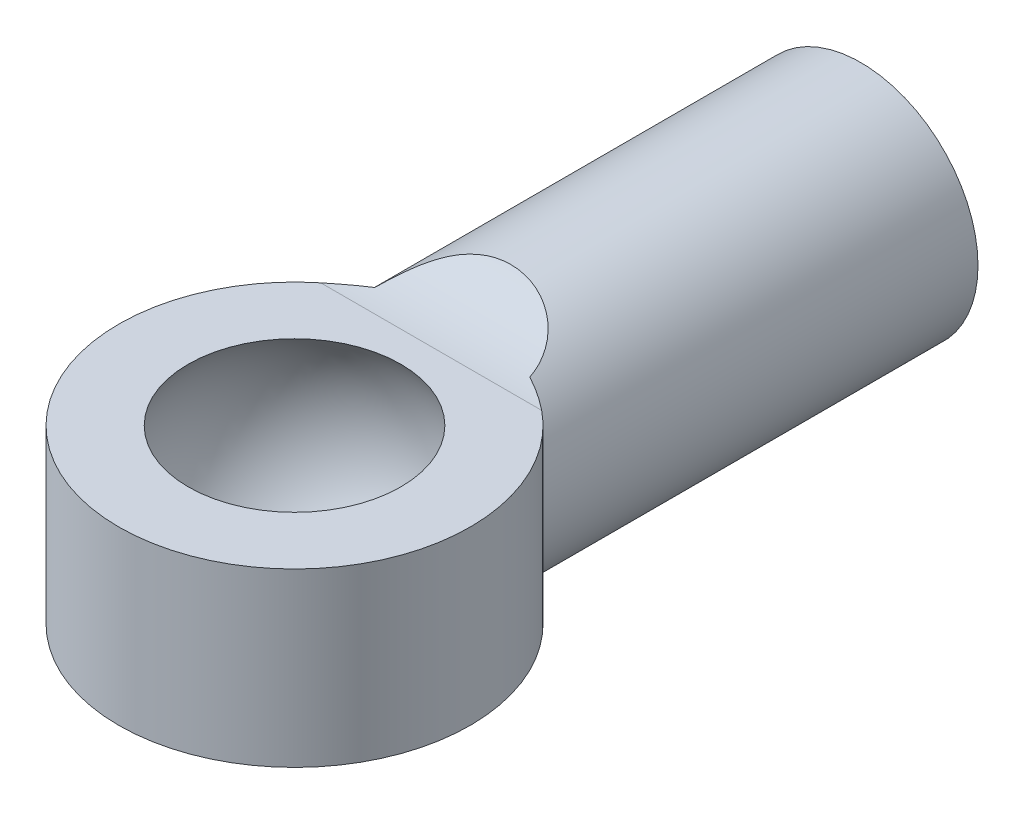
ISO-10303-21;
HEADER;
FILE_DESCRIPTION(('STEP AP214'),'2;1');
FILE_NAME('part.step','',(''),(''),'','','');
FILE_SCHEMA(('AUTOMOTIVE_DESIGN { 1 0 10303 214 1 1 1 1 }'));
ENDSEC;
DATA;
#1=APPLICATION_CONTEXT('core data for automotive mechanical design processes');
#2=APPLICATION_PROTOCOL_DEFINITION('international standard','automotive_design',2000,#1);
#3=PRODUCT_CONTEXT('',#1,'mechanical');
#4=PRODUCT('Part','Part','',(#3));
#5=PRODUCT_RELATED_PRODUCT_CATEGORY('part','',(#4));
#6=PRODUCT_DEFINITION_FORMATION('','',#4);
#7=PRODUCT_DEFINITION_CONTEXT('part definition',#1,'design');
#8=PRODUCT_DEFINITION('design','',#6,#7);
#9=PRODUCT_DEFINITION_SHAPE('','',#8);
#10=(LENGTH_UNIT() NAMED_UNIT(*) SI_UNIT(.MILLI.,.METRE.));
#11=(NAMED_UNIT(*) PLANE_ANGLE_UNIT() SI_UNIT($,.RADIAN.));
#12=(NAMED_UNIT(*) SI_UNIT($,.STERADIAN.) SOLID_ANGLE_UNIT());
#13=UNCERTAINTY_MEASURE_WITH_UNIT(LENGTH_MEASURE(1.E-05),#10,'distance_accuracy_value','');
#14=(GEOMETRIC_REPRESENTATION_CONTEXT(3) GLOBAL_UNCERTAINTY_ASSIGNED_CONTEXT((#13)) GLOBAL_UNIT_ASSIGNED_CONTEXT((#10,
#11,#12)) REPRESENTATION_CONTEXT('',''));
#15=CARTESIAN_POINT('',(0.,0.,0.));
#16=DIRECTION('',(0.,0.,1.));
#17=DIRECTION('',(1.,0.,0.));
#18=AXIS2_PLACEMENT_3D('',#15,#16,#17);
#19=CARTESIAN_POINT('',(0.,0.,12.));
#20=DIRECTION('',(0.,0.,-1.));
#21=DIRECTION('',(-1.,0.,0.));
#22=AXIS2_PLACEMENT_3D('',#19,#20,#21);
#23=CYLINDRICAL_SURFACE('',#22,3.);
#24=CARTESIAN_POINT('',(1.98583426974193,-2.2486578781839,10.4618739181251));
#25=CARTESIAN_POINT('',(2.00396344258288,-2.23264706002368,10.4707882630477));
#26=CARTESIAN_POINT('',(2.02188887402468,-2.21642667728664,10.4797553414252));
#27=CARTESIAN_POINT('',(2.16533009791416,-2.08344672270652,10.5526981013084));
#28=CARTESIAN_POINT('',(2.2806563095797,-1.95650770931752,10.6188131588102));
#29=CARTESIAN_POINT('',(2.48880177067207,-1.68385902351801,10.7488693801545));
#30=CARTESIAN_POINT('',(2.58156488423051,-1.53810388776794,10.8128047884442));
#31=CARTESIAN_POINT('',(2.72762982526368,-1.2571458702699,10.9199560604471));
#32=CARTESIAN_POINT('',(2.78502144127264,-1.12471394387148,10.9648327031429));
#33=CARTESIAN_POINT('',(2.88078101458543,-0.849794356010161,11.0424080187158));
#34=CARTESIAN_POINT('',(2.91918948889255,-0.707328859455994,11.075132591104));
#35=CARTESIAN_POINT('',(2.96104647539865,-0.487722819349375,11.111411163226));
#36=CARTESIAN_POINT('',(2.97239258027734,-0.413067791939371,11.1213898986211));
#37=CARTESIAN_POINT('',(2.98943725584207,-0.262642958108292,11.1364602207128));
#38=CARTESIAN_POINT('',(2.9951388625948,-0.186873773254045,11.1415544346527));
#39=CARTESIAN_POINT('',(3.00075826896958,-0.0349766015231395,11.1465741730226));
#40=CARTESIAN_POINT('',(3.00067827639566,0.041151237290717,11.1465016704532));
#41=CARTESIAN_POINT('',(2.99475194614686,0.192977883665955,11.1412098629645));
#42=CARTESIAN_POINT('',(2.98890607906159,0.268676725733381,11.1359909780743));
#43=CARTESIAN_POINT('',(2.9656435566549,0.47021885483297,11.1154221135443));
#44=CARTESIAN_POINT('',(2.94305491250344,0.595054783923677,11.0955903532735));
#45=CARTESIAN_POINT('',(2.88311206709104,0.838743854227943,11.0446882070705));
#46=CARTESIAN_POINT('',(2.84573597042278,0.957587827770217,11.0136011615418));
#47=CARTESIAN_POINT('',(2.74039122046619,1.23273200092434,10.9297954285942));
#48=CARTESIAN_POINT('',(2.66617507507191,1.38551275785537,10.8733711871864));
#49=CARTESIAN_POINT('',(2.49497805419315,1.67430722603556,10.7535359487626));
#50=CARTESIAN_POINT('',(2.39800712087454,1.81032822059377,10.6901280095102));
#51=CARTESIAN_POINT('',(2.21235575127324,2.02980585610405,10.5803378735073));
#52=CARTESIAN_POINT('',(2.12860529813086,2.11749146089412,10.5340200533864));
#53=CARTESIAN_POINT('',(2.02189044273492,2.21642556064357,10.4797566856895));
#54=CARTESIAN_POINT('',(2.00396513097984,2.23264594541698,10.4707897454018));
#55=CARTESIAN_POINT('',(1.98583426974193,2.2486578781839,10.4618739181251));
#56=B_SPLINE_CURVE_WITH_KNOTS('',3,(#24,#25,#26,#27,#28,#29,#30,#31,#32,#33,#34,#35,#36,#37,#38,
#39,#40,#41,#42,#43,#44,#45,#46,#47,#48,#49,#50,#51,#52,#53,#54,#55),.UNSPECIFIED.,.F.,.F.,(4,2,
2,2,2,2,2,2,2,2,2,2,2,2,2,4),(0.,0.0773456803517175,0.626141542848898,1.17628912782317,
1.62809695261956,2.07893624356484,2.30712469679806,2.53519034506865,2.76316890297447,
2.99112885564308,3.37454256246388,3.75852611777623,4.29261845738536,4.82647787108041,
5.21499910517706,5.29234478552878),.UNSPECIFIED.);
#57=CARTESIAN_POINT('',(1.98583426974193,-2.2486578781839,10.4618739181251));
#58=VERTEX_POINT('',#57);
#59=CARTESIAN_POINT('',(1.98583426974193,2.2486578781839,10.4618739181251));
#60=VERTEX_POINT('',#59);
#61=EDGE_CURVE('E57',#58,#60,#56,.T.);
#62=ORIENTED_EDGE('',*,*,#61,.F.);
#63=CARTESIAN_POINT('',(1.98583426974193,-2.2486578781839,10.4618739181251));
#64=CARTESIAN_POINT('',(1.97502394561147,-2.25819351123642,10.4095181028285));
#65=CARTESIAN_POINT('',(1.96254938670621,-2.26908227167806,10.3577497916272));
#66=CARTESIAN_POINT('',(1.93418135977784,-2.29331726265383,10.2557363077332));
#67=CARTESIAN_POINT('',(1.91828717330944,-2.30666400951265,10.2054914576463));
#68=CARTESIAN_POINT('',(1.88299058933512,-2.33556469764909,10.1068860311701));
#69=CARTESIAN_POINT('',(1.86358752929888,-2.35111905563874,10.0585258127286));
#70=CARTESIAN_POINT('',(1.82122190942769,-2.38408731811387,9.96407357766055));
#71=CARTESIAN_POINT('',(1.79825970184295,-2.40150103852452,9.91798133716555));
#72=CARTESIAN_POINT('',(1.72382449295788,-2.456057147341,9.78340028531918));
#73=CARTESIAN_POINT('',(1.66685512443128,-2.49546922832326,9.69875627003776));
#74=CARTESIAN_POINT('',(1.53876853028249,-2.57641178970525,9.54241281251451));
#75=CARTESIAN_POINT('',(1.46766981161845,-2.61793944671062,9.47069666894049));
#76=CARTESIAN_POINT('',(1.31530194403671,-2.69761113004928,9.34365113595016));
#77=CARTESIAN_POINT('',(1.23446628803176,-2.73582239339714,9.2878432925376));
#78=CARTESIAN_POINT('',(1.0627931505943,-2.80697465032155,9.18971728272768));
#79=CARTESIAN_POINT('',(0.971945409852168,-2.83991015149231,9.147413129647));
#80=CARTESIAN_POINT('',(0.781583895473862,-2.89813280242022,9.07553019732255));
#81=CARTESIAN_POINT('',(0.681970526141148,-2.92331184661366,9.04612905294371));
#82=CARTESIAN_POINT('',(0.477981132613831,-2.96349647505828,9.00025224488269));
#83=CARTESIAN_POINT('',(0.373613107648135,-2.97851851848967,8.9837556628189));
#84=CARTESIAN_POINT('',(0.223790947362484,-2.99197652387999,8.96907491700125));
#85=CARTESIAN_POINT('',(0.179153847261406,-2.99498059666431,8.96581743893957));
#86=CARTESIAN_POINT('',(0.089684486346388,-2.99899353994938,8.96147632373524));
#87=CARTESIAN_POINT('',(0.0448522223363826,-3.00000237765141,8.96039272232791));
#88=CARTESIAN_POINT('',(-0.110619865372835,-2.99999413595437,8.96039089292625));
#89=CARTESIAN_POINT('',(-0.221361131794522,-2.99383732507076,8.96697763247477));
#90=CARTESIAN_POINT('',(-0.440038767243054,-2.96959711123984,8.99360583003985));
#91=CARTESIAN_POINT('',(-0.547969664140814,-2.95149202081765,9.01367175548592));
#92=CARTESIAN_POINT('',(-0.757970567756772,-2.90466030744831,9.06798059154988));
#93=CARTESIAN_POINT('',(-0.86003412804245,-2.87592225037414,9.10223876852384));
#94=CARTESIAN_POINT('',(-1.05497771436313,-2.81026536974166,9.18562264602873));
#95=CARTESIAN_POINT('',(-1.14786541653369,-2.77335346933673,9.2347357773847));
#96=CARTESIAN_POINT('',(-1.31993308427235,-2.69564770776983,9.34689422870082));
#97=CARTESIAN_POINT('',(-1.39935423836713,-2.65494851227216,9.40963456064827));
#98=CARTESIAN_POINT('',(-1.54477201211523,-2.57306455453708,9.54889356617166));
#99=CARTESIAN_POINT('',(-1.61076662307727,-2.5318797206189,9.62541429815452));
#100=CARTESIAN_POINT('',(-1.72624575060594,-2.45453715014255,9.78747767252285));
#101=CARTESIAN_POINT('',(-1.77623237368698,-2.41825300295412,9.87260461829727));
#102=CARTESIAN_POINT('',(-1.86279132398585,-2.35222983444232,10.0516939199302));
#103=CARTESIAN_POINT('',(-1.89937509934928,-2.32248523603928,10.1456486488633));
#104=CARTESIAN_POINT('',(-1.94063185959484,-2.28782727153899,10.2784498112609));
#105=CARTESIAN_POINT('',(-1.95087955775204,-2.27908386932466,10.3146837900079));
#106=CARTESIAN_POINT('',(-1.96963835611927,-2.26289139367312,10.3878008133385));
#107=CARTESIAN_POINT('',(-1.97815296337021,-2.2554397109724,10.4246823797312));
#108=CARTESIAN_POINT('',(-1.98583426974193,-2.2486578781839,10.4618739181251));
#109=B_SPLINE_CURVE_WITH_KNOTS('',3,(#63,#64,#65,#66,#67,#68,#69,#70,#71,#72,#73,#74,#75,#76,
#77,#78,#79,#80,#81,#82,#83,#84,#85,#86,#87,#88,#89,#90,#91,#92,#93,#94,#95,#96,#97,#98,#99,
#100,#101,#102,#103,#104,#105,#106,#107,#108),.UNSPECIFIED.,.F.,.F.,(4,2,2,2,2,2,2,2,2,2,2,2,2,
2,2,2,2,2,2,2,2,2,4),(0.,0.162869949889913,0.325774151349316,0.488709143851404,
0.651628020898908,0.977952409452353,1.30385215479923,1.61855188320804,1.93357713427024,
2.25281278282816,2.57152986970544,2.70602034349497,2.84051302809058,3.1722148231994,
3.50452035656807,3.83718427716365,4.16956750559809,4.4951631826996,4.82080753510333,
5.13491442068979,5.44875238046031,5.56467397189046,5.68035860255983),.UNSPECIFIED.);
#110=CARTESIAN_POINT('',(-1.98583426974193,-2.2486578781839,10.4618739181251));
#111=VERTEX_POINT('',#110);
#112=EDGE_CURVE('E89',#58,#111,#109,.T.);
#113=ORIENTED_EDGE('',*,*,#112,.T.);
#114=CARTESIAN_POINT('',(-1.98583426974193,2.2486578781839,10.4618739181251));
#115=CARTESIAN_POINT('',(-2.00396344258288,2.23264706002368,10.4707882630477));
#116=CARTESIAN_POINT('',(-2.02188887402468,2.21642667728664,10.4797553414252));
#117=CARTESIAN_POINT('',(-2.16533009791416,2.08344672270652,10.5526981013084));
#118=CARTESIAN_POINT('',(-2.2806563095797,1.95650770931752,10.6188131588102));
#119=CARTESIAN_POINT('',(-2.48880177067207,1.68385902351801,10.7488693801545));
#120=CARTESIAN_POINT('',(-2.58156488423051,1.53810388776794,10.8128047884442));
#121=CARTESIAN_POINT('',(-2.72762982526368,1.2571458702699,10.9199560604471));
#122=CARTESIAN_POINT('',(-2.78502144127264,1.12471394387148,10.9648327031429));
#123=CARTESIAN_POINT('',(-2.88078101458543,0.849794356010161,11.0424080187158));
#124=CARTESIAN_POINT('',(-2.91918948889255,0.707328859455994,11.075132591104));
#125=CARTESIAN_POINT('',(-2.96104647539865,0.487722819349375,11.111411163226));
#126=CARTESIAN_POINT('',(-2.97239258027734,0.413067791939371,11.1213898986211));
#127=CARTESIAN_POINT('',(-2.98943725584207,0.262642958108292,11.1364602207128));
#128=CARTESIAN_POINT('',(-2.9951388625948,0.186873773254045,11.1415544346527));
#129=CARTESIAN_POINT('',(-3.00075826896958,0.0349766015231395,11.1465741730226));
#130=CARTESIAN_POINT('',(-3.00067827639566,-0.041151237290717,11.1465016704532));
#131=CARTESIAN_POINT('',(-2.99475194614686,-0.192977883665955,11.1412098629645));
#132=CARTESIAN_POINT('',(-2.98890607906159,-0.268676725733381,11.1359909780743));
#133=CARTESIAN_POINT('',(-2.9656435566549,-0.47021885483297,11.1154221135443));
#134=CARTESIAN_POINT('',(-2.94305491250344,-0.595054783923677,11.0955903532735));
#135=CARTESIAN_POINT('',(-2.88311206709104,-0.838743854227943,11.0446882070705));
#136=CARTESIAN_POINT('',(-2.84573597042278,-0.957587827770217,11.0136011615418));
#137=CARTESIAN_POINT('',(-2.74039122046619,-1.23273200092434,10.9297954285942));
#138=CARTESIAN_POINT('',(-2.66617507507191,-1.38551275785537,10.8733711871864));
#139=CARTESIAN_POINT('',(-2.49497805419315,-1.67430722603556,10.7535359487626));
#140=CARTESIAN_POINT('',(-2.39800712087454,-1.81032822059377,10.6901280095102));
#141=CARTESIAN_POINT('',(-2.21235575127324,-2.02980585610405,10.5803378735073));
#142=CARTESIAN_POINT('',(-2.12860529813086,-2.11749146089412,10.5340200533864));
#143=CARTESIAN_POINT('',(-2.02189044273492,-2.21642556064357,10.4797566856895));
#144=CARTESIAN_POINT('',(-2.00396513097984,-2.23264594541698,10.4707897454018));
#145=CARTESIAN_POINT('',(-1.98583426974193,-2.2486578781839,10.4618739181251));
#146=B_SPLINE_CURVE_WITH_KNOTS('',3,(#114,#115,#116,#117,#118,#119,#120,#121,#122,#123,#124,
#125,#126,#127,#128,#129,#130,#131,#132,#133,#134,#135,#136,#137,#138,#139,#140,#141,#142,#143,
#144,#145),.UNSPECIFIED.,.F.,.F.,(4,2,2,2,2,2,2,2,2,2,2,2,2,2,2,4),(0.,0.0773456803517175,
0.626141542848898,1.17628912782317,1.62809695261956,2.07893624356484,2.30712469679806,
2.53519034506865,2.76316890297447,2.99112885564308,3.37454256246388,3.75852611777623,
4.29261845738536,4.82647787108041,5.21499910517706,5.29234478552878),.UNSPECIFIED.);
#147=CARTESIAN_POINT('',(-1.98583426974193,2.2486578781839,10.4618739181251));
#148=VERTEX_POINT('',#147);
#149=EDGE_CURVE('E65',#148,#111,#146,.T.);
#150=ORIENTED_EDGE('',*,*,#149,.F.);
#151=CARTESIAN_POINT('',(-1.98583426974193,2.2486578781839,10.4618739181251));
#152=CARTESIAN_POINT('',(-1.97502394561147,2.25819351123642,10.4095181028285));
#153=CARTESIAN_POINT('',(-1.96254938670621,2.26908227167806,10.3577497916272));
#154=CARTESIAN_POINT('',(-1.93418135977784,2.29331726265383,10.2557363077332));
#155=CARTESIAN_POINT('',(-1.91828717330944,2.30666400951265,10.2054914576463));
#156=CARTESIAN_POINT('',(-1.88299058933512,2.33556469764909,10.1068860311701));
#157=CARTESIAN_POINT('',(-1.86358752929888,2.35111905563874,10.0585258127286));
#158=CARTESIAN_POINT('',(-1.82122190942769,2.38408731811387,9.96407357766055));
#159=CARTESIAN_POINT('',(-1.79825970184295,2.40150103852452,9.91798133716555));
#160=CARTESIAN_POINT('',(-1.72382449295788,2.456057147341,9.78340028531918));
#161=CARTESIAN_POINT('',(-1.66685512443128,2.49546922832326,9.69875627003776));
#162=CARTESIAN_POINT('',(-1.53876853028249,2.57641178970525,9.54241281251451));
#163=CARTESIAN_POINT('',(-1.46766981161845,2.61793944671062,9.47069666894049));
#164=CARTESIAN_POINT('',(-1.31530194403671,2.69761113004928,9.34365113595016));
#165=CARTESIAN_POINT('',(-1.23446628803176,2.73582239339714,9.2878432925376));
#166=CARTESIAN_POINT('',(-1.0627931505943,2.80697465032155,9.18971728272768));
#167=CARTESIAN_POINT('',(-0.971945409852168,2.83991015149231,9.147413129647));
#168=CARTESIAN_POINT('',(-0.781583895473862,2.89813280242022,9.07553019732255));
#169=CARTESIAN_POINT('',(-0.681970526141148,2.92331184661366,9.04612905294371));
#170=CARTESIAN_POINT('',(-0.477981132613831,2.96349647505828,9.00025224488269));
#171=CARTESIAN_POINT('',(-0.373613107648135,2.97851851848967,8.9837556628189));
#172=CARTESIAN_POINT('',(-0.223790947362484,2.99197652387999,8.96907491700125));
#173=CARTESIAN_POINT('',(-0.179153847261406,2.99498059666431,8.96581743893957));
#174=CARTESIAN_POINT('',(-0.0896844863463881,2.99899353994938,8.96147632373524));
#175=CARTESIAN_POINT('',(-0.0448522223363829,3.00000237765141,8.96039272232791));
#176=CARTESIAN_POINT('',(0.110619865372834,2.99999413595437,8.96039089292625));
#177=CARTESIAN_POINT('',(0.221361131794521,2.99383732507076,8.96697763247477));
#178=CARTESIAN_POINT('',(0.440038767243053,2.96959711123984,8.99360583003985));
#179=CARTESIAN_POINT('',(0.547969664140813,2.95149202081765,9.01367175548592));
#180=CARTESIAN_POINT('',(0.757970567756771,2.90466030744831,9.06798059154988));
#181=CARTESIAN_POINT('',(0.860034128042449,2.87592225037414,9.10223876852384));
#182=CARTESIAN_POINT('',(1.05497771436313,2.81026536974166,9.18562264602873));
#183=CARTESIAN_POINT('',(1.14786541653369,2.77335346933673,9.2347357773847));
#184=CARTESIAN_POINT('',(1.31993308427235,2.69564770776983,9.34689422870083));
#185=CARTESIAN_POINT('',(1.39935423836713,2.65494851227216,9.40963456064827));
#186=CARTESIAN_POINT('',(1.54477201211523,2.57306455453708,9.54889356617166));
#187=CARTESIAN_POINT('',(1.61076662307727,2.5318797206189,9.62541429815452));
#188=CARTESIAN_POINT('',(1.72624575060594,2.45453715014255,9.78747767252284));
#189=CARTESIAN_POINT('',(1.77623237368698,2.41825300295412,9.87260461829727));
#190=CARTESIAN_POINT('',(1.86279132398585,2.35222983444232,10.0516939199302));
#191=CARTESIAN_POINT('',(1.89937509934928,2.32248523603928,10.1456486488633));
#192=CARTESIAN_POINT('',(1.94063185959484,2.28782727153899,10.2784498112609));
#193=CARTESIAN_POINT('',(1.95087955775204,2.27908386932466,10.3146837900079));
#194=CARTESIAN_POINT('',(1.96963835611927,2.26289139367312,10.3878008133385));
#195=CARTESIAN_POINT('',(1.97815296337022,2.2554397109724,10.4246823797312));
#196=CARTESIAN_POINT('',(1.98583426974193,2.2486578781839,10.4618739181251));
#197=B_SPLINE_CURVE_WITH_KNOTS('',3,(#151,#152,#153,#154,#155,#156,#157,#158,#159,#160,#161,
#162,#163,#164,#165,#166,#167,#168,#169,#170,#171,#172,#173,#174,#175,#176,#177,#178,#179,#180,
#181,#182,#183,#184,#185,#186,#187,#188,#189,#190,#191,#192,#193,#194,#195,#196),.UNSPECIFIED.,
.F.,.F.,(4,2,2,2,2,2,2,2,2,2,2,2,2,2,2,2,2,2,2,2,2,2,4),(0.,0.162869949889913,0.325774151349316,
0.488709143851404,0.651628020898908,0.977952409452353,1.30385215479923,1.61855188320804,
1.93357713427024,2.25281278282816,2.57152986970544,2.70602034349497,2.84051302809058,
3.1722148231994,3.50452035656807,3.83718427716365,4.16956750559809,4.4951631826996,
4.82080753510333,5.13491442068979,5.44875238046031,5.56467397189046,5.68035860255983),.UNSPECIFIED.);
#198=EDGE_CURVE('E87',#148,#60,#197,.T.);
#199=ORIENTED_EDGE('',*,*,#198,.T.);
#200=EDGE_LOOP('',(#62,#113,#150,#199));
#201=FACE_BOUND('',#200,.T.);
#202=CARTESIAN_POINT('',(0.,0.,0.));
#203=DIRECTION('',(0.,0.,1.));
#204=DIRECTION('',(1.,0.,0.));
#205=AXIS2_PLACEMENT_3D('',#202,#203,#204);
#206=CIRCLE('',#205,3.);
#207=CARTESIAN_POINT('',(3.,0.,0.));
#208=VERTEX_POINT('',#207);
#209=EDGE_CURVE('E99',#208,#208,#206,.T.);
#210=ORIENTED_EDGE('',*,*,#209,.T.);
#211=EDGE_LOOP('',(#210));
#212=FACE_BOUND('',#211,.T.);
#213=ADVANCED_FACE('F39',(#201,#212),#23,.T.);
#214=CARTESIAN_POINT('',(0.,0.,0.));
#215=DIRECTION('',(0.,0.,1.));
#216=DIRECTION('',(1.,0.,0.));
#217=AXIS2_PLACEMENT_3D('',#214,#215,#216);
#218=PLANE('',#217);
#219=CARTESIAN_POINT('',(0.,0.,0.));
#220=DIRECTION('',(0.,0.,1.));
#221=DIRECTION('',(1.,0.,0.));
#222=AXIS2_PLACEMENT_3D('',#219,#220,#221);
#223=CIRCLE('',#222,1.6);
#224=CARTESIAN_POINT('',(1.6,0.,0.));
#225=VERTEX_POINT('',#224);
#226=EDGE_CURVE('E44',#225,#225,#223,.F.);
#227=ORIENTED_EDGE('',*,*,#226,.F.);
#228=EDGE_LOOP('',(#227));
#229=FACE_BOUND('',#228,.T.);
#230=ORIENTED_EDGE('',*,*,#209,.F.);
#231=EDGE_LOOP('',(#230));
#232=FACE_BOUND('',#231,.T.);
#233=ADVANCED_FACE('F126',(#229,#232),#218,.F.);
#234=CARTESIAN_POINT('',(0.,2.2,14.5));
#235=DIRECTION('',(0.,-1.,0.));
#236=DIRECTION('',(0.,0.,-1.));
#237=AXIS2_PLACEMENT_3D('',#234,#235,#236);
#238=CYLINDRICAL_SURFACE('',#237,4.5);
#239=CARTESIAN_POINT('',(0.,2.2,14.5));
#240=DIRECTION('',(0.,1.,0.));
#241=DIRECTION('',(0.,0.,1.));
#242=AXIS2_PLACEMENT_3D('',#239,#240,#241);
#243=CIRCLE('',#242,4.5);
#244=CARTESIAN_POINT('',(-2.82842712474619,2.2,11.));
#245=VERTEX_POINT('',#244);
#246=CARTESIAN_POINT('',(2.82842712474619,2.2,11.));
#247=VERTEX_POINT('',#246);
#248=EDGE_CURVE('E95',#245,#247,#243,.T.);
#249=ORIENTED_EDGE('',*,*,#248,.F.);
#250=CARTESIAN_POINT('',(-2.82842712474619,2.2,11.));
#251=CARTESIAN_POINT('',(-2.76327757894186,2.20000364839019,10.9473463000922));
#252=CARTESIAN_POINT('',(-2.69666643711069,2.20138591252435,10.8965283204584));
#253=CARTESIAN_POINT('',(-2.56100366008866,2.20634987955325,10.7988905621436));
#254=CARTESIAN_POINT('',(-2.49196133344618,2.20992390485845,10.7520574739263));
#255=CARTESIAN_POINT('',(-2.35146609486263,2.2187210024987,10.6623502125829));
#256=CARTESIAN_POINT('',(-2.28001333771257,2.22394396912277,10.619475785901));
#257=CARTESIAN_POINT('',(-2.13465607569939,2.2355542753394,10.5376488430502));
#258=CARTESIAN_POINT('',(-2.06074387645081,2.24194561964884,10.4987105540476));
#259=CARTESIAN_POINT('',(-1.98583426974193,2.2486578781839,10.4618739181251));
#260=B_SPLINE_CURVE_WITH_KNOTS('',3,(#250,#251,#252,#253,#254,#255,#256,#257,#258,#259),
.UNSPECIFIED.,.F.,.F.,(4,2,2,2,4),(0.,0.251232174502331,0.50158928735925,0.751930353483139,
1.00314614678165),.UNSPECIFIED.);
#261=EDGE_CURVE('E82',#245,#148,#260,.T.);
#262=ORIENTED_EDGE('',*,*,#261,.T.);
#263=ORIENTED_EDGE('',*,*,#149,.T.);
#264=CARTESIAN_POINT('',(-1.98583426974193,-2.2486578781839,10.4618739181251));
#265=CARTESIAN_POINT('',(-2.06074387645081,-2.24194561964884,10.4987105540476));
#266=CARTESIAN_POINT('',(-2.13465607569939,-2.2355542753394,10.5376488430502));
#267=CARTESIAN_POINT('',(-2.28001333771257,-2.22394396912277,10.619475785901));
#268=CARTESIAN_POINT('',(-2.35146609486263,-2.2187210024987,10.6623502125829));
#269=CARTESIAN_POINT('',(-2.49196133344618,-2.20992390485845,10.7520574739263));
#270=CARTESIAN_POINT('',(-2.56100366008866,-2.20634987955325,10.7988905621436));
#271=CARTESIAN_POINT('',(-2.69666643711069,-2.20138591252435,10.8965283204584));
#272=CARTESIAN_POINT('',(-2.76327757894186,-2.20000364839019,10.9473463000922));
#273=CARTESIAN_POINT('',(-2.82842712474619,-2.2,11.));
#274=B_SPLINE_CURVE_WITH_KNOTS('',3,(#264,#265,#266,#267,#268,#269,#270,#271,#272,#273),
.UNSPECIFIED.,.F.,.F.,(4,2,2,2,4),(0.,0.251215793298507,0.501556859422395,0.751913972279314,
1.00314614678164),.UNSPECIFIED.);
#275=CARTESIAN_POINT('',(-2.82842712474619,-2.2,11.));
#276=VERTEX_POINT('',#275);
#277=EDGE_CURVE('E49',#111,#276,#274,.T.);
#278=ORIENTED_EDGE('',*,*,#277,.T.);
#279=CARTESIAN_POINT('',(0.,-2.2,14.5));
#280=DIRECTION('',(0.,1.,0.));
#281=DIRECTION('',(0.,0.,1.));
#282=AXIS2_PLACEMENT_3D('',#279,#280,#281);
#283=CIRCLE('',#282,4.5);
#284=CARTESIAN_POINT('',(2.82842712474619,-2.2,11.));
#285=VERTEX_POINT('',#284);
#286=EDGE_CURVE('E100',#276,#285,#283,.T.);
#287=ORIENTED_EDGE('',*,*,#286,.T.);
#288=CARTESIAN_POINT('',(2.82842712474619,-2.2,11.));
#289=CARTESIAN_POINT('',(2.76327757894186,-2.20000364839019,10.9473463000922));
#290=CARTESIAN_POINT('',(2.69666643711069,-2.20138591252435,10.8965283204584));
#291=CARTESIAN_POINT('',(2.56100366008866,-2.20634987955325,10.7988905621436));
#292=CARTESIAN_POINT('',(2.49196133344618,-2.20992390485845,10.7520574739263));
#293=CARTESIAN_POINT('',(2.35146609486263,-2.2187210024987,10.6623502125829));
#294=CARTESIAN_POINT('',(2.28001333771257,-2.22394396912277,10.619475785901));
#295=CARTESIAN_POINT('',(2.13465607569939,-2.2355542753394,10.5376488430502));
#296=CARTESIAN_POINT('',(2.06074387645081,-2.24194561964884,10.4987105540476));
#297=CARTESIAN_POINT('',(1.98583426974193,-2.2486578781839,10.4618739181251));
#298=B_SPLINE_CURVE_WITH_KNOTS('',3,(#288,#289,#290,#291,#292,#293,#294,#295,#296,#297),
.UNSPECIFIED.,.F.,.F.,(4,2,2,2,4),(0.,0.251232174502331,0.50158928735925,0.751930353483139,
1.00314614678165),.UNSPECIFIED.);
#299=EDGE_CURVE('E11',#285,#58,#298,.T.);
#300=ORIENTED_EDGE('',*,*,#299,.T.);
#301=ORIENTED_EDGE('',*,*,#61,.T.);
#302=CARTESIAN_POINT('',(1.98583426974193,2.2486578781839,10.4618739181251));
#303=CARTESIAN_POINT('',(2.06074387645081,2.24194561964884,10.4987105540476));
#304=CARTESIAN_POINT('',(2.13465607569939,2.2355542753394,10.5376488430502));
#305=CARTESIAN_POINT('',(2.28001333771257,2.22394396912277,10.619475785901));
#306=CARTESIAN_POINT('',(2.35146609486263,2.2187210024987,10.6623502125829));
#307=CARTESIAN_POINT('',(2.49196133344618,2.20992390485845,10.7520574739263));
#308=CARTESIAN_POINT('',(2.56100366008866,2.20634987955325,10.7988905621436));
#309=CARTESIAN_POINT('',(2.69666643711069,2.20138591252435,10.8965283204584));
#310=CARTESIAN_POINT('',(2.76327757894186,2.20000364839019,10.9473463000922));
#311=CARTESIAN_POINT('',(2.82842712474619,2.2,11.));
#312=B_SPLINE_CURVE_WITH_KNOTS('',3,(#302,#303,#304,#305,#306,#307,#308,#309,#310,#311),
.UNSPECIFIED.,.F.,.F.,(4,2,2,2,4),(0.,0.251215793298507,0.501556859422395,0.751913972279314,
1.00314614678164),.UNSPECIFIED.);
#313=EDGE_CURVE('E90',#60,#247,#312,.T.);
#314=ORIENTED_EDGE('',*,*,#313,.T.);
#315=EDGE_LOOP('',(#249,#262,#263,#278,#287,#300,#301,#314));
#316=FACE_BOUND('',#315,.T.);
#317=ADVANCED_FACE('F98',(#316),#238,.T.);
#318=CARTESIAN_POINT('',(0.,2.2,14.5));
#319=DIRECTION('',(0.,1.,0.));
#320=DIRECTION('',(0.,0.,1.));
#321=AXIS2_PLACEMENT_3D('',#318,#319,#320);
#322=PLANE('',#321);
#323=CARTESIAN_POINT('',(0.,2.2,14.5));
#324=DIRECTION('',(0.,1.,0.));
#325=DIRECTION('',(0.,0.,1.));
#326=AXIS2_PLACEMENT_3D('',#323,#324,#325);
#327=CIRCLE('',#326,2.72213151776324);
#328=CARTESIAN_POINT('',(0.,2.2,17.2221315177632));
#329=VERTEX_POINT('',#328);
#330=EDGE_CURVE('E105',#329,#329,#327,.T.);
#331=ORIENTED_EDGE('',*,*,#330,.F.);
#332=EDGE_LOOP('',(#331));
#333=FACE_BOUND('',#332,.T.);
#334=ORIENTED_EDGE('',*,*,#248,.T.);
#335=DIRECTION('',(1.,0.,0.));
#336=VECTOR('',#335,1.);
#337=CARTESIAN_POINT('',(0.,2.2,11.));
#338=LINE('',#337,#336);
#339=EDGE_CURVE('E86',#247,#245,#338,.F.);
#340=ORIENTED_EDGE('',*,*,#339,.T.);
#341=EDGE_LOOP('',(#334,#340));
#342=FACE_BOUND('',#341,.T.);
#343=ADVANCED_FACE('F94',(#333,#342),#322,.T.);
#344=CARTESIAN_POINT('',(0.,-2.2,14.5));
#345=DIRECTION('',(0.,1.,0.));
#346=DIRECTION('',(0.,0.,1.));
#347=AXIS2_PLACEMENT_3D('',#344,#345,#346);
#348=PLANE('',#347);
#349=CARTESIAN_POINT('',(0.,-2.2,14.5));
#350=DIRECTION('',(0.,1.,0.));
#351=DIRECTION('',(0.,0.,1.));
#352=AXIS2_PLACEMENT_3D('',#349,#350,#351);
#353=CIRCLE('',#352,2.72213151776324);
#354=CARTESIAN_POINT('',(0.,-2.2,17.2221315177632));
#355=VERTEX_POINT('',#354);
#356=EDGE_CURVE('E158',#355,#355,#353,.T.);
#357=ORIENTED_EDGE('',*,*,#356,.T.);
#358=EDGE_LOOP('',(#357));
#359=FACE_BOUND('',#358,.T.);
#360=ORIENTED_EDGE('',*,*,#286,.F.);
#361=DIRECTION('',(-1.,0.,0.));
#362=VECTOR('',#361,1.);
#363=CARTESIAN_POINT('',(0.,-2.2,11.));
#364=LINE('',#363,#362);
#365=EDGE_CURVE('E96',#276,#285,#364,.F.);
#366=ORIENTED_EDGE('',*,*,#365,.T.);
#367=EDGE_LOOP('',(#360,#366));
#368=FACE_BOUND('',#367,.T.);
#369=ADVANCED_FACE('F127',(#359,#368),#348,.F.);
#370=CARTESIAN_POINT('',(0.,5.2,11.));
#371=DIRECTION('',(1.,0.,0.));
#372=DIRECTION('',(0.,0.,-1.));
#373=AXIS2_PLACEMENT_3D('',#370,#371,#372);
#374=CYLINDRICAL_SURFACE('',#373,3.);
#375=ORIENTED_EDGE('',*,*,#261,.F.);
#376=ORIENTED_EDGE('',*,*,#339,.F.);
#377=ORIENTED_EDGE('',*,*,#313,.F.);
#378=ORIENTED_EDGE('',*,*,#198,.F.);
#379=EDGE_LOOP('',(#375,#376,#377,#378));
#380=FACE_BOUND('',#379,.T.);
#381=ADVANCED_FACE('F84',(#380),#374,.F.);
#382=CARTESIAN_POINT('',(0.,-5.2,11.));
#383=DIRECTION('',(-1.,0.,0.));
#384=DIRECTION('',(0.,0.,1.));
#385=AXIS2_PLACEMENT_3D('',#382,#383,#384);
#386=CYLINDRICAL_SURFACE('',#385,3.);
#387=ORIENTED_EDGE('',*,*,#299,.F.);
#388=ORIENTED_EDGE('',*,*,#365,.F.);
#389=ORIENTED_EDGE('',*,*,#277,.F.);
#390=ORIENTED_EDGE('',*,*,#112,.F.);
#391=EDGE_LOOP('',(#387,#388,#389,#390));
#392=FACE_BOUND('',#391,.T.);
#393=ADVANCED_FACE('F41',(#392),#386,.F.);
#394=CARTESIAN_POINT('',(0.,0.,14.5));
#395=DIRECTION('',(0.,0.,1.));
#396=DIRECTION('',(-1.,0.,0.));
#397=AXIS2_PLACEMENT_3D('',#394,#395,#396);
#398=SPHERICAL_SURFACE('',#397,3.5);
#399=CARTESIAN_POINT('',(0.,0.,14.5));
#400=DIRECTION('',(0.,1.,0.));
#401=DIRECTION('',(0.,0.,1.));
#402=AXIS2_PLACEMENT_3D('',#399,#400,#401);
#403=SPHERICAL_SURFACE('',#402,3.5);
#404=ORIENTED_EDGE('',*,*,#330,.T.);
#405=EDGE_LOOP('',(#404));
#406=FACE_BOUND('',#405,.T.);
#407=ORIENTED_EDGE('',*,*,#356,.F.);
#408=EDGE_LOOP('',(#407));
#409=FACE_BOUND('',#408,.T.);
#410=ADVANCED_FACE('F174',(#406,#409),#403,.F.);
#411=CARTESIAN_POINT('',(0.,0.,-1.2E-05));
#412=DIRECTION('',(0.,0.,1.));
#413=DIRECTION('',(1.,0.,0.));
#414=AXIS2_PLACEMENT_3D('',#411,#412,#413);
#415=CYLINDRICAL_SURFACE('',#414,1.6);
#416=CARTESIAN_POINT('',(0.,0.,5.));
#417=DIRECTION('',(0.,0.,-1.));
#418=DIRECTION('',(-1.,0.,0.));
#419=AXIS2_PLACEMENT_3D('',#416,#417,#418);
#420=CIRCLE('',#419,1.6);
#421=CARTESIAN_POINT('',(1.6,0.,5.));
#422=VERTEX_POINT('',#421);
#423=EDGE_CURVE('E164',#422,#422,#420,.T.);
#424=CARTESIAN_POINT('',(1.6,0.,5.));
#425=CARTESIAN_POINT('',(1.6,0.,4.94791666666667));
#426=CARTESIAN_POINT('',(1.6,0.,4.89583333333333));
#427=CARTESIAN_POINT('',(1.6,0.,4.79166666666667));
#428=CARTESIAN_POINT('',(1.6,0.,4.73958333333333));
#429=CARTESIAN_POINT('',(1.6,0.,4.63541666666667));
#430=CARTESIAN_POINT('',(1.6,0.,4.58333333333333));
#431=CARTESIAN_POINT('',(1.6,0.,4.47916666666667));
#432=CARTESIAN_POINT('',(1.6,0.,4.42708333333333));
#433=CARTESIAN_POINT('',(1.6,0.,4.32291666666667));
#434=CARTESIAN_POINT('',(1.6,0.,4.27083333333333));
#435=CARTESIAN_POINT('',(1.6,0.,4.16666666666667));
#436=CARTESIAN_POINT('',(1.6,0.,4.11458333333333));
#437=CARTESIAN_POINT('',(1.6,0.,4.01041666666667));
#438=CARTESIAN_POINT('',(1.6,0.,3.95833333333333));
#439=CARTESIAN_POINT('',(1.6,0.,3.85416666666667));
#440=CARTESIAN_POINT('',(1.6,0.,3.80208333333333));
#441=CARTESIAN_POINT('',(1.6,0.,3.69791666666667));
#442=CARTESIAN_POINT('',(1.6,0.,3.64583333333333));
#443=CARTESIAN_POINT('',(1.6,0.,3.54166666666667));
#444=CARTESIAN_POINT('',(1.6,0.,3.48958333333333));
#445=CARTESIAN_POINT('',(1.6,0.,3.38541666666667));
#446=CARTESIAN_POINT('',(1.6,0.,3.33333333333333));
#447=CARTESIAN_POINT('',(1.6,0.,3.22916666666667));
#448=CARTESIAN_POINT('',(1.6,0.,3.17708333333333));
#449=CARTESIAN_POINT('',(1.6,0.,3.07291666666667));
#450=CARTESIAN_POINT('',(1.6,0.,3.02083333333333));
#451=CARTESIAN_POINT('',(1.6,0.,2.91666666666667));
#452=CARTESIAN_POINT('',(1.6,0.,2.86458333333333));
#453=CARTESIAN_POINT('',(1.6,0.,2.76041666666667));
#454=CARTESIAN_POINT('',(1.6,0.,2.70833333333333));
#455=CARTESIAN_POINT('',(1.6,0.,2.60416666666667));
#456=CARTESIAN_POINT('',(1.6,0.,2.55208333333333));
#457=CARTESIAN_POINT('',(1.6,0.,2.44791666666667));
#458=CARTESIAN_POINT('',(1.6,0.,2.39583333333333));
#459=CARTESIAN_POINT('',(1.6,0.,2.29166666666667));
#460=CARTESIAN_POINT('',(1.6,0.,2.23958333333333));
#461=CARTESIAN_POINT('',(1.6,0.,2.13541666666667));
#462=CARTESIAN_POINT('',(1.6,0.,2.08333333333333));
#463=CARTESIAN_POINT('',(1.6,0.,1.97916666666667));
#464=CARTESIAN_POINT('',(1.6,0.,1.92708333333333));
#465=CARTESIAN_POINT('',(1.6,0.,1.82291666666667));
#466=CARTESIAN_POINT('',(1.6,0.,1.77083333333333));
#467=CARTESIAN_POINT('',(1.6,0.,1.66666666666667));
#468=CARTESIAN_POINT('',(1.6,0.,1.61458333333333));
#469=CARTESIAN_POINT('',(1.6,0.,1.51041666666667));
#470=CARTESIAN_POINT('',(1.6,0.,1.45833333333333));
#471=CARTESIAN_POINT('',(1.6,0.,1.35416666666667));
#472=CARTESIAN_POINT('',(1.6,0.,1.30208333333333));
#473=CARTESIAN_POINT('',(1.6,0.,1.19791666666667));
#474=CARTESIAN_POINT('',(1.6,0.,1.14583333333333));
#475=CARTESIAN_POINT('',(1.6,0.,1.04166666666667));
#476=CARTESIAN_POINT('',(1.6,0.,0.989583333333333));
#477=CARTESIAN_POINT('',(1.6,0.,0.885416666666667));
#478=CARTESIAN_POINT('',(1.6,0.,0.833333333333333));
#479=CARTESIAN_POINT('',(1.6,0.,0.729166666666667));
#480=CARTESIAN_POINT('',(1.6,0.,0.677083333333334));
#481=CARTESIAN_POINT('',(1.6,0.,0.572916666666667));
#482=CARTESIAN_POINT('',(1.6,0.,0.520833333333333));
#483=CARTESIAN_POINT('',(1.6,0.,0.416666666666667));
#484=CARTESIAN_POINT('',(1.6,0.,0.364583333333333));
#485=CARTESIAN_POINT('',(1.6,0.,0.260416666666667));
#486=CARTESIAN_POINT('',(1.6,0.,0.208333333333333));
#487=CARTESIAN_POINT('',(1.6,0.,0.104166666666667));
#488=CARTESIAN_POINT('',(1.6,0.,0.0520833333333332));
#489=CARTESIAN_POINT('',(1.6,0.,0.));
#490=B_SPLINE_CURVE_WITH_KNOTS('',3,(#424,#425,#426,#427,#428,#429,#430,#431,#432,#433,#434,
#435,#436,#437,#438,#439,#440,#441,#442,#443,#444,#445,#446,#447,#448,#449,#450,#451,#452,#453,
#454,#455,#456,#457,#458,#459,#460,#461,#462,#463,#464,#465,#466,#467,#468,#469,#470,#471,#472,
#473,#474,#475,#476,#477,#478,#479,#480,#481,#482,#483,#484,#485,#486,#487,#488,#489),
.UNSPECIFIED.,.F.,.F.,(4,2,2,2,2,2,2,2,2,2,2,2,2,2,2,2,2,2,2,2,2,2,2,2,2,2,2,2,2,2,2,2,4),(0.,
0.15625,0.3125,0.46875,0.625000000000001,0.781250000000001,0.937500000000001,1.09375,1.25,
1.40625,1.5625,1.71875,1.875,2.03125,2.1875,2.34375,2.5,2.65625,2.8125,2.96875,3.125,3.28125,
3.4375,3.59375,3.75,3.90625,4.0625,4.21875,4.375,4.53125,4.6875,4.84375,5.),.UNSPECIFIED.);
#491=EDGE_CURVE('BSEAM172',#422,#225,#490,.T.);
#492=ORIENTED_EDGE('',*,*,#423,.F.);
#493=ORIENTED_EDGE('',*,*,#226,.T.);
#494=ORIENTED_EDGE('',*,*,#491,.T.);
#495=ORIENTED_EDGE('',*,*,#491,.F.);
#496=EDGE_LOOP('',(#492,#494,#493,#495));
#497=FACE_BOUND('',#496,.T.);
#498=ADVANCED_FACE('F172',(#497),#415,.F.);
#499=CARTESIAN_POINT('',(0.,0.,5.));
#500=DIRECTION('',(0.,0.,-1.));
#501=DIRECTION('',(-1.,0.,0.));
#502=AXIS2_PLACEMENT_3D('',#499,#500,#501);
#503=PLANE('',#502);
#504=ORIENTED_EDGE('',*,*,#423,.T.);
#505=EDGE_LOOP('',(#504));
#506=FACE_BOUND('',#505,.T.);
#507=ADVANCED_FACE('F170',(#506),#503,.T.);
#508=CLOSED_SHELL('',(#213,#233,#317,#343,#369,#381,#393,#410,#498,#507));
#509=MANIFOLD_SOLID_BREP('B2',#508);
#510=ADVANCED_BREP_SHAPE_REPRESENTATION('',(#18,#509),#14);
#511=SHAPE_DEFINITION_REPRESENTATION(#9,#510);
ENDSEC;
END-ISO-10303-21;
